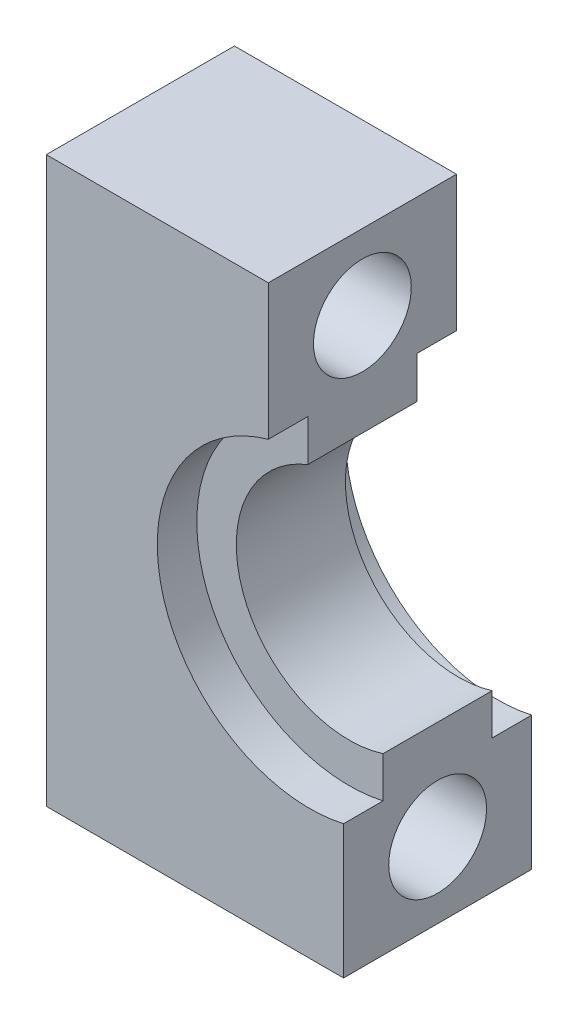
ISO-10303-21;
HEADER;
FILE_DESCRIPTION(('STEP AP214'),'2;1');
FILE_NAME('part.step','',(''),(''),'','','');
FILE_SCHEMA(('AUTOMOTIVE_DESIGN { 1 0 10303 214 1 1 1 1 }'));
ENDSEC;
DATA;
#1=APPLICATION_CONTEXT('core data for automotive mechanical design processes');
#2=APPLICATION_PROTOCOL_DEFINITION('international standard','automotive_design',2000,#1);
#3=PRODUCT_CONTEXT('',#1,'mechanical');
#4=PRODUCT('Part','Part','',(#3));
#5=PRODUCT_RELATED_PRODUCT_CATEGORY('part','',(#4));
#6=PRODUCT_DEFINITION_FORMATION('','',#4);
#7=PRODUCT_DEFINITION_CONTEXT('part definition',#1,'design');
#8=PRODUCT_DEFINITION('design','',#6,#7);
#9=PRODUCT_DEFINITION_SHAPE('','',#8);
#10=(LENGTH_UNIT() NAMED_UNIT(*) SI_UNIT(.MILLI.,.METRE.));
#11=(NAMED_UNIT(*) PLANE_ANGLE_UNIT() SI_UNIT($,.RADIAN.));
#12=(NAMED_UNIT(*) SI_UNIT($,.STERADIAN.) SOLID_ANGLE_UNIT());
#13=UNCERTAINTY_MEASURE_WITH_UNIT(LENGTH_MEASURE(1.E-05),#10,'distance_accuracy_value','');
#14=(GEOMETRIC_REPRESENTATION_CONTEXT(3) GLOBAL_UNCERTAINTY_ASSIGNED_CONTEXT((#13)) GLOBAL_UNIT_ASSIGNED_CONTEXT((#10,
#11,#12)) REPRESENTATION_CONTEXT('',''));
#15=CARTESIAN_POINT('',(0.,0.,0.));
#16=DIRECTION('',(0.,0.,1.));
#17=DIRECTION('',(1.,0.,0.));
#18=AXIS2_PLACEMENT_3D('',#15,#16,#17);
#19=CARTESIAN_POINT('',(14.,0.,5.));
#20=DIRECTION('',(0.,0.,-1.));
#21=DIRECTION('',(-1.,0.,0.));
#22=AXIS2_PLACEMENT_3D('',#19,#20,#21);
#23=CYLINDRICAL_SURFACE('',#22,8.1);
#24=CARTESIAN_POINT('',(14.,0.,-2.9));
#25=DIRECTION('',(0.,0.,1.));
#26=DIRECTION('',(1.,0.,0.));
#27=AXIS2_PLACEMENT_3D('',#24,#25,#26);
#28=CIRCLE('',#27,8.1);
#29=CARTESIAN_POINT('',(15.8,-7.89746794865291,-2.9));
#30=VERTEX_POINT('',#29);
#31=CARTESIAN_POINT('',(11.8,7.79551152907877,-2.9));
#32=VERTEX_POINT('',#31);
#33=EDGE_CURVE('E48',#30,#32,#28,.F.);
#34=ORIENTED_EDGE('',*,*,#33,.F.);
#35=DIRECTION('',(0.,0.,-1.));
#36=VECTOR('',#35,1.);
#37=CARTESIAN_POINT('',(15.8,-7.89746794865291,5.));
#38=LINE('',#37,#36);
#39=CARTESIAN_POINT('',(15.8,-7.89746794865291,-5.));
#40=VERTEX_POINT('',#39);
#41=EDGE_CURVE('E182',#30,#40,#38,.T.);
#42=ORIENTED_EDGE('',*,*,#41,.T.);
#43=CARTESIAN_POINT('',(14.,0.,-5.));
#44=DIRECTION('',(0.,0.,-1.));
#45=DIRECTION('',(1.,0.,0.));
#46=AXIS2_PLACEMENT_3D('',#43,#44,#45);
#47=CIRCLE('',#46,8.1);
#48=CARTESIAN_POINT('',(11.8,7.79551152907877,-5.));
#49=VERTEX_POINT('',#48);
#50=EDGE_CURVE('E165',#40,#49,#47,.T.);
#51=ORIENTED_EDGE('',*,*,#50,.T.);
#52=DIRECTION('',(0.,0.,-1.));
#53=VECTOR('',#52,1.);
#54=CARTESIAN_POINT('',(11.8,7.79551152907877,5.));
#55=LINE('',#54,#53);
#56=EDGE_CURVE('E181',#32,#49,#55,.T.);
#57=ORIENTED_EDGE('',*,*,#56,.F.);
#58=EDGE_LOOP('',(#34,#42,#51,#57));
#59=FACE_BOUND('',#58,.T.);
#60=ADVANCED_FACE('F33',(#59),#23,.F.);
#61=CARTESIAN_POINT('',(0.,-15.,5.));
#62=DIRECTION('',(0.,1.,0.));
#63=DIRECTION('',(-1.,0.,0.));
#64=AXIS2_PLACEMENT_3D('',#61,#62,#63);
#65=PLANE('',#64);
#66=DIRECTION('',(1.,0.,0.));
#67=VECTOR('',#66,1.);
#68=CARTESIAN_POINT('',(0.,-15.,-5.));
#69=LINE('',#68,#67);
#70=CARTESIAN_POINT('',(0.,-15.,-5.));
#71=VERTEX_POINT('',#70);
#72=CARTESIAN_POINT('',(15.8,-15.,-5.));
#73=VERTEX_POINT('',#72);
#74=EDGE_CURVE('E144',#71,#73,#69,.T.);
#75=ORIENTED_EDGE('',*,*,#74,.T.);
#76=DIRECTION('',(0.,0.,-1.));
#77=VECTOR('',#76,1.);
#78=CARTESIAN_POINT('',(15.8,-15.,5.));
#79=LINE('',#78,#77);
#80=CARTESIAN_POINT('',(15.8,-15.,5.));
#81=VERTEX_POINT('',#80);
#82=EDGE_CURVE('E11',#81,#73,#79,.T.);
#83=ORIENTED_EDGE('',*,*,#82,.F.);
#84=DIRECTION('',(1.,0.,0.));
#85=VECTOR('',#84,1.);
#86=CARTESIAN_POINT('',(0.,-15.,5.));
#87=LINE('',#86,#85);
#88=CARTESIAN_POINT('',(0.,-15.,5.));
#89=VERTEX_POINT('',#88);
#90=EDGE_CURVE('E145',#89,#81,#87,.T.);
#91=ORIENTED_EDGE('',*,*,#90,.F.);
#92=DIRECTION('',(0.,0.,-1.));
#93=VECTOR('',#92,1.);
#94=CARTESIAN_POINT('',(0.,-15.,5.));
#95=LINE('',#94,#93);
#96=EDGE_CURVE('E159',#89,#71,#95,.T.);
#97=ORIENTED_EDGE('',*,*,#96,.T.);
#98=EDGE_LOOP('',(#75,#83,#91,#97));
#99=FACE_BOUND('',#98,.T.);
#100=ADVANCED_FACE('F35',(#99),#65,.F.);
#101=CARTESIAN_POINT('',(15.8,-15.,5.));
#102=DIRECTION('',(-1.,0.,0.));
#103=DIRECTION('',(0.,0.,1.));
#104=AXIS2_PLACEMENT_3D('',#101,#102,#103);
#105=PLANE('',#104);
#106=CARTESIAN_POINT('',(15.8,-11.,0.));
#107=DIRECTION('',(-1.,0.,0.));
#108=DIRECTION('',(0.,0.,1.));
#109=AXIS2_PLACEMENT_3D('',#106,#107,#108);
#110=CIRCLE('',#109,2.6);
#111=CARTESIAN_POINT('',(15.8,-11.,2.6));
#112=VERTEX_POINT('',#111);
#113=EDGE_CURVE('E238',#112,#112,#110,.T.);
#114=ORIENTED_EDGE('',*,*,#113,.T.);
#115=EDGE_LOOP('',(#114));
#116=FACE_BOUND('',#115,.T.);
#117=DIRECTION('',(0.,1.,0.));
#118=VECTOR('',#117,1.);
#119=CARTESIAN_POINT('',(15.8,-5.72363520850167,2.9));
#120=LINE('',#119,#118);
#121=CARTESIAN_POINT('',(15.8,-7.89746794865291,2.9));
#122=VERTEX_POINT('',#121);
#123=CARTESIAN_POINT('',(15.8,-5.72363520850167,2.9));
#124=VERTEX_POINT('',#123);
#125=EDGE_CURVE('E122',#122,#124,#120,.T.);
#126=ORIENTED_EDGE('',*,*,#125,.F.);
#127=CARTESIAN_POINT('',(15.8,-7.89746794865291,5.));
#128=VERTEX_POINT('',#127);
#129=EDGE_CURVE('E41',#128,#122,#38,.T.);
#130=ORIENTED_EDGE('',*,*,#129,.F.);
#131=DIRECTION('',(0.,1.,0.));
#132=VECTOR('',#131,1.);
#133=CARTESIAN_POINT('',(15.8,-15.,5.));
#134=LINE('',#133,#132);
#135=EDGE_CURVE('E148',#81,#128,#134,.T.);
#136=ORIENTED_EDGE('',*,*,#135,.F.);
#137=ORIENTED_EDGE('',*,*,#82,.T.);
#138=DIRECTION('',(0.,1.,0.));
#139=VECTOR('',#138,1.);
#140=CARTESIAN_POINT('',(15.8,-15.,-5.));
#141=LINE('',#140,#139);
#142=EDGE_CURVE('E162',#73,#40,#141,.T.);
#143=ORIENTED_EDGE('',*,*,#142,.T.);
#144=ORIENTED_EDGE('',*,*,#41,.F.);
#145=DIRECTION('',(0.,1.,0.));
#146=VECTOR('',#145,1.);
#147=CARTESIAN_POINT('',(15.8,-5.72363520850167,-2.9));
#148=LINE('',#147,#146);
#149=CARTESIAN_POINT('',(15.8,-5.72363520850167,-2.9));
#150=VERTEX_POINT('',#149);
#151=EDGE_CURVE('E131',#30,#150,#148,.T.);
#152=ORIENTED_EDGE('',*,*,#151,.T.);
#153=DIRECTION('',(0.,0.,-1.));
#154=VECTOR('',#153,1.);
#155=CARTESIAN_POINT('',(15.8,-5.72363520850167,2.9));
#156=LINE('',#155,#154);
#157=EDGE_CURVE('E136',#124,#150,#156,.T.);
#158=ORIENTED_EDGE('',*,*,#157,.F.);
#159=EDGE_LOOP('',(#126,#130,#136,#137,#143,#144,#152,#158));
#160=FACE_BOUND('',#159,.T.);
#161=ADVANCED_FACE('F187',(#116,#160),#105,.F.);
#162=ORIENTED_EDGE('',*,*,#129,.T.);
#163=CARTESIAN_POINT('',(14.,0.,2.9));
#164=DIRECTION('',(0.,0.,1.));
#165=DIRECTION('',(1.,0.,0.));
#166=AXIS2_PLACEMENT_3D('',#163,#164,#165);
#167=CIRCLE('',#166,8.1);
#168=CARTESIAN_POINT('',(11.8,7.79551152907877,2.9));
#169=VERTEX_POINT('',#168);
#170=EDGE_CURVE('E138',#122,#169,#167,.F.);
#171=ORIENTED_EDGE('',*,*,#170,.T.);
#172=CARTESIAN_POINT('',(11.8,7.79551152907877,5.));
#173=VERTEX_POINT('',#172);
#174=EDGE_CURVE('E120',#173,#169,#55,.T.);
#175=ORIENTED_EDGE('',*,*,#174,.F.);
#176=CARTESIAN_POINT('',(14.,0.,5.));
#177=DIRECTION('',(0.,0.,-1.));
#178=DIRECTION('',(1.,0.,0.));
#179=AXIS2_PLACEMENT_3D('',#176,#177,#178);
#180=CIRCLE('',#179,8.1);
#181=EDGE_CURVE('E151',#128,#173,#180,.T.);
#182=ORIENTED_EDGE('',*,*,#181,.F.);
#183=EDGE_LOOP('',(#162,#171,#175,#182));
#184=FACE_BOUND('',#183,.T.);
#185=ADVANCED_FACE('F203',(#184),#23,.F.);
#186=CARTESIAN_POINT('',(11.8,15.,5.));
#187=DIRECTION('',(-1.,0.,0.));
#188=DIRECTION('',(0.,-1.,0.));
#189=AXIS2_PLACEMENT_3D('',#186,#187,#188);
#190=PLANE('',#189);
#191=CARTESIAN_POINT('',(11.8,11.,0.));
#192=DIRECTION('',(-1.,0.,0.));
#193=DIRECTION('',(0.,-1.,0.));
#194=AXIS2_PLACEMENT_3D('',#191,#192,#193);
#195=CIRCLE('',#194,2.6);
#196=CARTESIAN_POINT('',(11.8,8.4,0.));
#197=VERTEX_POINT('',#196);
#198=EDGE_CURVE('E243',#197,#197,#195,.T.);
#199=ORIENTED_EDGE('',*,*,#198,.T.);
#200=EDGE_LOOP('',(#199));
#201=FACE_BOUND('',#200,.T.);
#202=ORIENTED_EDGE('',*,*,#174,.T.);
#203=DIRECTION('',(0.,1.,0.));
#204=VECTOR('',#203,1.);
#205=CARTESIAN_POINT('',(11.8,8.2103593100424,2.9));
#206=LINE('',#205,#204);
#207=CARTESIAN_POINT('',(11.8,5.58211429478115,2.9));
#208=VERTEX_POINT('',#207);
#209=EDGE_CURVE('E111',#208,#169,#206,.T.);
#210=ORIENTED_EDGE('',*,*,#209,.F.);
#211=DIRECTION('',(0.,0.,-1.));
#212=VECTOR('',#211,1.);
#213=CARTESIAN_POINT('',(11.8,5.58211429478115,2.9));
#214=LINE('',#213,#212);
#215=CARTESIAN_POINT('',(11.8,5.58211429478115,-2.9));
#216=VERTEX_POINT('',#215);
#217=EDGE_CURVE('E116',#208,#216,#214,.T.);
#218=ORIENTED_EDGE('',*,*,#217,.T.);
#219=DIRECTION('',(0.,1.,0.));
#220=VECTOR('',#219,1.);
#221=CARTESIAN_POINT('',(11.8,8.2103593100424,-2.9));
#222=LINE('',#221,#220);
#223=EDGE_CURVE('E207',#216,#32,#222,.T.);
#224=ORIENTED_EDGE('',*,*,#223,.T.);
#225=ORIENTED_EDGE('',*,*,#56,.T.);
#226=DIRECTION('',(0.,1.,0.));
#227=VECTOR('',#226,1.);
#228=CARTESIAN_POINT('',(11.8,15.,-5.));
#229=LINE('',#228,#227);
#230=CARTESIAN_POINT('',(11.8,15.,-5.));
#231=VERTEX_POINT('',#230);
#232=EDGE_CURVE('E168',#49,#231,#229,.T.);
#233=ORIENTED_EDGE('',*,*,#232,.T.);
#234=DIRECTION('',(0.,0.,-1.));
#235=VECTOR('',#234,1.);
#236=CARTESIAN_POINT('',(11.8,15.,5.));
#237=LINE('',#236,#235);
#238=CARTESIAN_POINT('',(11.8,15.,5.));
#239=VERTEX_POINT('',#238);
#240=EDGE_CURVE('E178',#239,#231,#237,.T.);
#241=ORIENTED_EDGE('',*,*,#240,.F.);
#242=DIRECTION('',(0.,1.,0.));
#243=VECTOR('',#242,1.);
#244=CARTESIAN_POINT('',(11.8,15.,5.));
#245=LINE('',#244,#243);
#246=EDGE_CURVE('E153',#173,#239,#245,.T.);
#247=ORIENTED_EDGE('',*,*,#246,.F.);
#248=EDGE_LOOP('',(#202,#210,#218,#224,#225,#233,#241,#247));
#249=FACE_BOUND('',#248,.T.);
#250=ADVANCED_FACE('F113',(#201,#249),#190,.F.);
#251=CARTESIAN_POINT('',(0.,15.,5.));
#252=DIRECTION('',(0.,-1.,0.));
#253=DIRECTION('',(0.,0.,-1.));
#254=AXIS2_PLACEMENT_3D('',#251,#252,#253);
#255=PLANE('',#254);
#256=DIRECTION('',(-1.,0.,0.));
#257=VECTOR('',#256,1.);
#258=CARTESIAN_POINT('',(0.,15.,-5.));
#259=LINE('',#258,#257);
#260=CARTESIAN_POINT('',(0.,15.,-5.));
#261=VERTEX_POINT('',#260);
#262=EDGE_CURVE('E170',#231,#261,#259,.T.);
#263=ORIENTED_EDGE('',*,*,#262,.T.);
#264=DIRECTION('',(0.,0.,-1.));
#265=VECTOR('',#264,1.);
#266=CARTESIAN_POINT('',(0.,15.,5.));
#267=LINE('',#266,#265);
#268=CARTESIAN_POINT('',(0.,15.,5.));
#269=VERTEX_POINT('',#268);
#270=EDGE_CURVE('E175',#269,#261,#267,.T.);
#271=ORIENTED_EDGE('',*,*,#270,.F.);
#272=DIRECTION('',(-1.,0.,0.));
#273=VECTOR('',#272,1.);
#274=CARTESIAN_POINT('',(0.,15.,5.));
#275=LINE('',#274,#273);
#276=EDGE_CURVE('E155',#239,#269,#275,.T.);
#277=ORIENTED_EDGE('',*,*,#276,.F.);
#278=ORIENTED_EDGE('',*,*,#240,.T.);
#279=EDGE_LOOP('',(#263,#271,#277,#278));
#280=FACE_BOUND('',#279,.T.);
#281=ADVANCED_FACE('F197',(#280),#255,.F.);
#282=CARTESIAN_POINT('',(0.,-15.,5.));
#283=DIRECTION('',(1.,0.,0.));
#284=DIRECTION('',(0.,0.,-1.));
#285=AXIS2_PLACEMENT_3D('',#282,#283,#284);
#286=PLANE('',#285);
#287=CARTESIAN_POINT('',(0.,-11.,0.));
#288=DIRECTION('',(1.,0.,0.));
#289=DIRECTION('',(0.,0.,-1.));
#290=AXIS2_PLACEMENT_3D('',#287,#288,#289);
#291=CIRCLE('',#290,2.6);
#292=CARTESIAN_POINT('',(0.,-11.,-2.6));
#293=VERTEX_POINT('',#292);
#294=EDGE_CURVE('E240',#293,#293,#291,.T.);
#295=ORIENTED_EDGE('',*,*,#294,.T.);
#296=EDGE_LOOP('',(#295));
#297=FACE_BOUND('',#296,.T.);
#298=CARTESIAN_POINT('',(0.,11.,0.));
#299=DIRECTION('',(1.,0.,0.));
#300=DIRECTION('',(0.,0.,-1.));
#301=AXIS2_PLACEMENT_3D('',#298,#299,#300);
#302=CIRCLE('',#301,2.6);
#303=CARTESIAN_POINT('',(0.,11.,-2.6));
#304=VERTEX_POINT('',#303);
#305=EDGE_CURVE('E208',#304,#304,#302,.T.);
#306=ORIENTED_EDGE('',*,*,#305,.T.);
#307=EDGE_LOOP('',(#306));
#308=FACE_BOUND('',#307,.T.);
#309=DIRECTION('',(0.,-1.,0.));
#310=VECTOR('',#309,1.);
#311=CARTESIAN_POINT('',(0.,-15.,-5.));
#312=LINE('',#311,#310);
#313=EDGE_CURVE('E149',#261,#71,#312,.T.);
#314=ORIENTED_EDGE('',*,*,#313,.T.);
#315=ORIENTED_EDGE('',*,*,#96,.F.);
#316=DIRECTION('',(0.,-1.,0.));
#317=VECTOR('',#316,1.);
#318=CARTESIAN_POINT('',(0.,-15.,5.));
#319=LINE('',#318,#317);
#320=EDGE_CURVE('E157',#269,#89,#319,.T.);
#321=ORIENTED_EDGE('',*,*,#320,.F.);
#322=ORIENTED_EDGE('',*,*,#270,.T.);
#323=EDGE_LOOP('',(#314,#315,#321,#322));
#324=FACE_BOUND('',#323,.T.);
#325=ADVANCED_FACE('F262',(#297,#308,#324),#286,.F.);
#326=CARTESIAN_POINT('',(14.,0.,5.));
#327=DIRECTION('',(0.,0.,1.));
#328=DIRECTION('',(1.,0.,0.));
#329=AXIS2_PLACEMENT_3D('',#326,#327,#328);
#330=PLANE('',#329);
#331=ORIENTED_EDGE('',*,*,#90,.T.);
#332=ORIENTED_EDGE('',*,*,#135,.T.);
#333=ORIENTED_EDGE('',*,*,#181,.T.);
#334=ORIENTED_EDGE('',*,*,#246,.T.);
#335=ORIENTED_EDGE('',*,*,#276,.T.);
#336=ORIENTED_EDGE('',*,*,#320,.T.);
#337=EDGE_LOOP('',(#331,#332,#333,#334,#335,#336));
#338=FACE_BOUND('',#337,.T.);
#339=ADVANCED_FACE('F201',(#338),#330,.T.);
#340=CARTESIAN_POINT('',(14.,0.,-5.));
#341=DIRECTION('',(0.,0.,1.));
#342=DIRECTION('',(1.,0.,0.));
#343=AXIS2_PLACEMENT_3D('',#340,#341,#342);
#344=PLANE('',#343);
#345=ORIENTED_EDGE('',*,*,#74,.F.);
#346=ORIENTED_EDGE('',*,*,#313,.F.);
#347=ORIENTED_EDGE('',*,*,#262,.F.);
#348=ORIENTED_EDGE('',*,*,#232,.F.);
#349=ORIENTED_EDGE('',*,*,#50,.F.);
#350=ORIENTED_EDGE('',*,*,#142,.F.);
#351=EDGE_LOOP('',(#345,#346,#347,#348,#349,#350));
#352=FACE_BOUND('',#351,.T.);
#353=ADVANCED_FACE('F191',(#352),#344,.F.);
#354=CARTESIAN_POINT('',(14.,0.,2.9));
#355=DIRECTION('',(0.,0.,1.));
#356=DIRECTION('',(1.,0.,0.));
#357=AXIS2_PLACEMENT_3D('',#354,#355,#356);
#358=PLANE('',#357);
#359=ORIENTED_EDGE('',*,*,#170,.F.);
#360=ORIENTED_EDGE('',*,*,#125,.T.);
#361=CARTESIAN_POINT('',(14.,0.,2.9));
#362=DIRECTION('',(0.,0.,-1.));
#363=DIRECTION('',(1.,0.,0.));
#364=AXIS2_PLACEMENT_3D('',#361,#362,#363);
#365=CIRCLE('',#364,6.);
#366=EDGE_CURVE('E123',#124,#208,#365,.T.);
#367=ORIENTED_EDGE('',*,*,#366,.T.);
#368=ORIENTED_EDGE('',*,*,#209,.T.);
#369=EDGE_LOOP('',(#359,#360,#367,#368));
#370=FACE_BOUND('',#369,.T.);
#371=ADVANCED_FACE('F126',(#370),#358,.T.);
#372=CARTESIAN_POINT('',(14.,0.,-2.9));
#373=DIRECTION('',(0.,0.,1.));
#374=DIRECTION('',(1.,0.,0.));
#375=AXIS2_PLACEMENT_3D('',#372,#373,#374);
#376=PLANE('',#375);
#377=ORIENTED_EDGE('',*,*,#151,.F.);
#378=ORIENTED_EDGE('',*,*,#33,.T.);
#379=ORIENTED_EDGE('',*,*,#223,.F.);
#380=CARTESIAN_POINT('',(14.,0.,-2.9));
#381=DIRECTION('',(0.,0.,-1.));
#382=DIRECTION('',(1.,0.,0.));
#383=AXIS2_PLACEMENT_3D('',#380,#381,#382);
#384=CIRCLE('',#383,6.);
#385=EDGE_CURVE('E135',#150,#216,#384,.T.);
#386=ORIENTED_EDGE('',*,*,#385,.F.);
#387=EDGE_LOOP('',(#377,#378,#379,#386));
#388=FACE_BOUND('',#387,.T.);
#389=ADVANCED_FACE('F210',(#388),#376,.F.);
#390=CARTESIAN_POINT('',(14.,0.,2.9));
#391=DIRECTION('',(0.,0.,-1.));
#392=DIRECTION('',(-1.,0.,0.));
#393=AXIS2_PLACEMENT_3D('',#390,#391,#392);
#394=CYLINDRICAL_SURFACE('',#393,6.);
#395=ORIENTED_EDGE('',*,*,#385,.T.);
#396=ORIENTED_EDGE('',*,*,#217,.F.);
#397=ORIENTED_EDGE('',*,*,#366,.F.);
#398=ORIENTED_EDGE('',*,*,#157,.T.);
#399=EDGE_LOOP('',(#395,#396,#397,#398));
#400=FACE_BOUND('',#399,.T.);
#401=ADVANCED_FACE('F133',(#400),#394,.F.);
#402=CARTESIAN_POINT('',(15.801,11.,0.));
#403=DIRECTION('',(-1.,0.,0.));
#404=DIRECTION('',(0.,0.,1.));
#405=AXIS2_PLACEMENT_3D('',#402,#403,#404);
#406=CYLINDRICAL_SURFACE('',#405,2.6);
#407=ORIENTED_EDGE('',*,*,#305,.F.);
#408=EDGE_LOOP('',(#407));
#409=FACE_BOUND('',#408,.T.);
#410=ORIENTED_EDGE('',*,*,#198,.F.);
#411=EDGE_LOOP('',(#410));
#412=FACE_BOUND('',#411,.T.);
#413=ADVANCED_FACE('F217',(#409,#412),#406,.F.);
#414=CARTESIAN_POINT('',(15.801,-11.,0.));
#415=DIRECTION('',(-1.,0.,0.));
#416=DIRECTION('',(0.,0.,1.));
#417=AXIS2_PLACEMENT_3D('',#414,#415,#416);
#418=CYLINDRICAL_SURFACE('',#417,2.6);
#419=ORIENTED_EDGE('',*,*,#294,.F.);
#420=EDGE_LOOP('',(#419));
#421=FACE_BOUND('',#420,.T.);
#422=ORIENTED_EDGE('',*,*,#113,.F.);
#423=EDGE_LOOP('',(#422));
#424=FACE_BOUND('',#423,.T.);
#425=ADVANCED_FACE('F252',(#421,#424),#418,.F.);
#426=CLOSED_SHELL('',(#60,#100,#161,#185,#250,#281,#325,#339,#353,#371,#389,#401,#413,#425));
#427=MANIFOLD_SOLID_BREP('B2',#426);
#428=ADVANCED_BREP_SHAPE_REPRESENTATION('',(#18,#427),#14);
#429=SHAPE_DEFINITION_REPRESENTATION(#9,#428);
ENDSEC;
END-ISO-10303-21;
